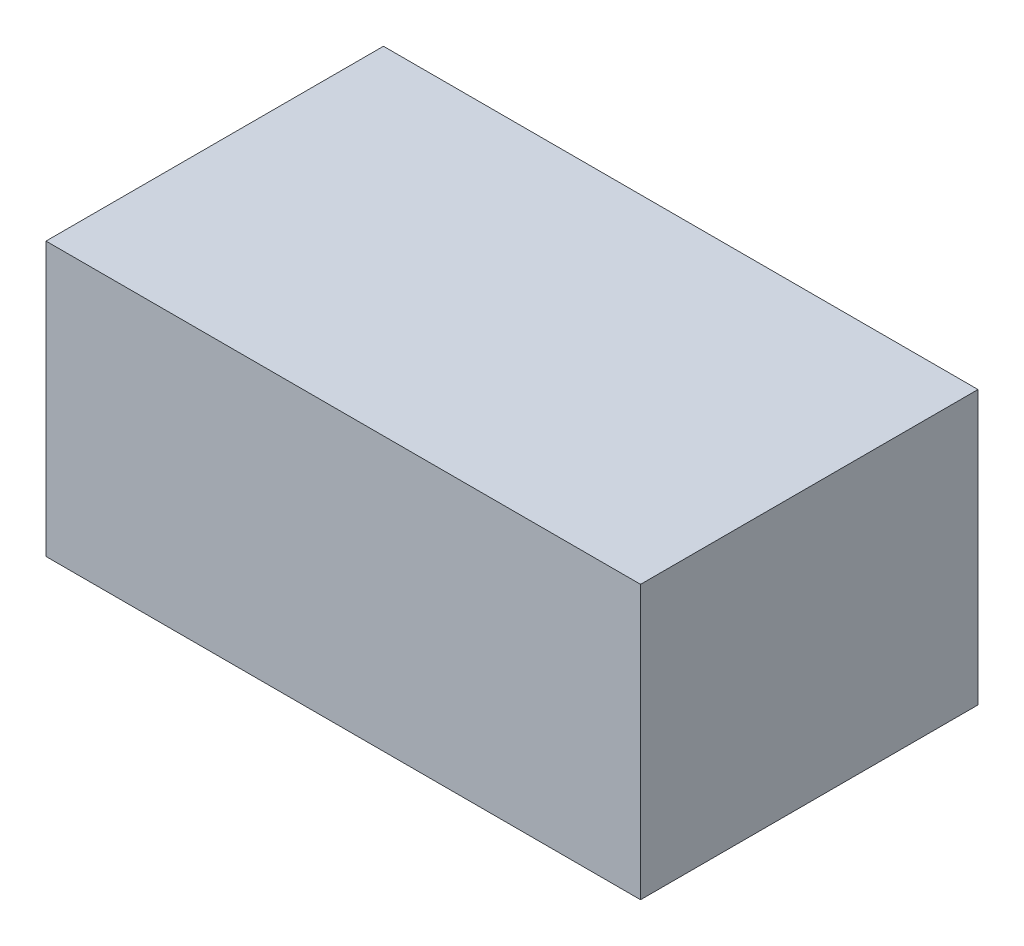
ISO-10303-21;
HEADER;
FILE_DESCRIPTION(('STEP AP214'),'2;1');
FILE_NAME('part.step','',(''),(''),'','','');
FILE_SCHEMA(('AUTOMOTIVE_DESIGN { 1 0 10303 214 1 1 1 1 }'));
ENDSEC;
DATA;
#1=APPLICATION_CONTEXT('core data for automotive mechanical design processes');
#2=APPLICATION_PROTOCOL_DEFINITION('international standard','automotive_design',2000,#1);
#3=PRODUCT_CONTEXT('',#1,'mechanical');
#4=PRODUCT('Part','Part','',(#3));
#5=PRODUCT_RELATED_PRODUCT_CATEGORY('part','',(#4));
#6=PRODUCT_DEFINITION_FORMATION('','',#4);
#7=PRODUCT_DEFINITION_CONTEXT('part definition',#1,'design');
#8=PRODUCT_DEFINITION('design','',#6,#7);
#9=PRODUCT_DEFINITION_SHAPE('','',#8);
#10=(LENGTH_UNIT() NAMED_UNIT(*) SI_UNIT(.MILLI.,.METRE.));
#11=(NAMED_UNIT(*) PLANE_ANGLE_UNIT() SI_UNIT($,.RADIAN.));
#12=(NAMED_UNIT(*) SI_UNIT($,.STERADIAN.) SOLID_ANGLE_UNIT());
#13=UNCERTAINTY_MEASURE_WITH_UNIT(LENGTH_MEASURE(1.E-05),#10,'distance_accuracy_value','');
#14=(GEOMETRIC_REPRESENTATION_CONTEXT(3) GLOBAL_UNCERTAINTY_ASSIGNED_CONTEXT((#13)) GLOBAL_UNIT_ASSIGNED_CONTEXT((#10,
#11,#12)) REPRESENTATION_CONTEXT('',''));
#15=CARTESIAN_POINT('',(0.,0.,0.));
#16=DIRECTION('',(0.,0.,1.));
#17=DIRECTION('',(1.,0.,0.));
#18=AXIS2_PLACEMENT_3D('',#15,#16,#17);
#19=CARTESIAN_POINT('',(-23.8225806451621,17.,42.2258064516134));
#20=DIRECTION('',(1.,0.,0.));
#21=DIRECTION('',(0.,0.,-1.));
#22=AXIS2_PLACEMENT_3D('',#19,#20,#21);
#23=PLANE('',#22);
#24=DIRECTION('',(0.,0.,1.));
#25=VECTOR('',#24,1.);
#26=CARTESIAN_POINT('',(-23.8225806451621,0.,42.2258064516134));
#27=LINE('',#26,#25);
#28=CARTESIAN_POINT('',(-23.8225806451621,0.,21.2258064516134));
#29=VERTEX_POINT('',#28);
#30=CARTESIAN_POINT('',(-23.8225806451621,0.,42.2258064516134));
#31=VERTEX_POINT('',#30);
#32=EDGE_CURVE('E140',#29,#31,#27,.T.);
#33=ORIENTED_EDGE('',*,*,#32,.T.);
#34=DIRECTION('',(0.,-1.,0.));
#35=VECTOR('',#34,1.);
#36=CARTESIAN_POINT('',(-23.8225806451621,17.,42.2258064516134));
#37=LINE('',#36,#35);
#38=CARTESIAN_POINT('',(-23.8225806451621,17.,42.2258064516134));
#39=VERTEX_POINT('',#38);
#40=EDGE_CURVE('E11',#39,#31,#37,.T.);
#41=ORIENTED_EDGE('',*,*,#40,.F.);
#42=DIRECTION('',(0.,0.,1.));
#43=VECTOR('',#42,1.);
#44=CARTESIAN_POINT('',(-23.8225806451621,17.,42.2258064516134));
#45=LINE('',#44,#43);
#46=CARTESIAN_POINT('',(-23.8225806451621,17.,21.2258064516134));
#47=VERTEX_POINT('',#46);
#48=EDGE_CURVE('E144',#47,#39,#45,.T.);
#49=ORIENTED_EDGE('',*,*,#48,.F.);
#50=DIRECTION('',(0.,-1.,0.));
#51=VECTOR('',#50,1.);
#52=CARTESIAN_POINT('',(-23.8225806451621,17.,21.2258064516134));
#53=LINE('',#52,#51);
#54=EDGE_CURVE('E150',#47,#29,#53,.T.);
#55=ORIENTED_EDGE('',*,*,#54,.T.);
#56=EDGE_LOOP('',(#33,#41,#49,#55));
#57=FACE_BOUND('',#56,.T.);
#58=ADVANCED_FACE('F33',(#57),#23,.F.);
#59=CARTESIAN_POINT('',(-23.8225806451621,17.,42.2258064516134));
#60=DIRECTION('',(0.,0.,-1.));
#61=DIRECTION('',(-1.,0.,0.));
#62=AXIS2_PLACEMENT_3D('',#59,#60,#61);
#63=PLANE('',#62);
#64=DIRECTION('',(1.,0.,0.));
#65=VECTOR('',#64,1.);
#66=CARTESIAN_POINT('',(-23.8225806451621,0.,42.2258064516134));
#67=LINE('',#66,#65);
#68=CARTESIAN_POINT('',(13.1774193548379,0.,42.2258064516134));
#69=VERTEX_POINT('',#68);
#70=EDGE_CURVE('E153',#31,#69,#67,.T.);
#71=ORIENTED_EDGE('',*,*,#70,.T.);
#72=DIRECTION('',(0.,-1.,0.));
#73=VECTOR('',#72,1.);
#74=CARTESIAN_POINT('',(13.1774193548379,17.,42.2258064516134));
#75=LINE('',#74,#73);
#76=CARTESIAN_POINT('',(13.1774193548379,17.,42.2258064516134));
#77=VERTEX_POINT('',#76);
#78=EDGE_CURVE('E40',#77,#69,#75,.T.);
#79=ORIENTED_EDGE('',*,*,#78,.F.);
#80=DIRECTION('',(1.,0.,0.));
#81=VECTOR('',#80,1.);
#82=CARTESIAN_POINT('',(-23.8225806451621,17.,42.2258064516134));
#83=LINE('',#82,#81);
#84=EDGE_CURVE('E84',#39,#77,#83,.T.);
#85=ORIENTED_EDGE('',*,*,#84,.F.);
#86=ORIENTED_EDGE('',*,*,#40,.T.);
#87=EDGE_LOOP('',(#71,#79,#85,#86));
#88=FACE_BOUND('',#87,.T.);
#89=ADVANCED_FACE('F182',(#88),#63,.F.);
#90=CARTESIAN_POINT('',(13.1774193548379,17.,42.2258064516134));
#91=DIRECTION('',(-1.,0.,0.));
#92=DIRECTION('',(0.,0.,1.));
#93=AXIS2_PLACEMENT_3D('',#90,#91,#92);
#94=PLANE('',#93);
#95=DIRECTION('',(0.,0.,-1.));
#96=VECTOR('',#95,1.);
#97=CARTESIAN_POINT('',(13.1774193548379,0.,42.2258064516134));
#98=LINE('',#97,#96);
#99=CARTESIAN_POINT('',(13.1774193548379,0.,21.2258064516134));
#100=VERTEX_POINT('',#99);
#101=EDGE_CURVE('E155',#69,#100,#98,.T.);
#102=ORIENTED_EDGE('',*,*,#101,.T.);
#103=DIRECTION('',(0.,-1.,0.));
#104=VECTOR('',#103,1.);
#105=CARTESIAN_POINT('',(13.1774193548379,17.,21.2258064516134));
#106=LINE('',#105,#104);
#107=CARTESIAN_POINT('',(13.1774193548379,17.,21.2258064516134));
#108=VERTEX_POINT('',#107);
#109=EDGE_CURVE('E159',#108,#100,#106,.T.);
#110=ORIENTED_EDGE('',*,*,#109,.F.);
#111=DIRECTION('',(0.,0.,-1.));
#112=VECTOR('',#111,1.);
#113=CARTESIAN_POINT('',(13.1774193548379,17.,42.2258064516134));
#114=LINE('',#113,#112);
#115=EDGE_CURVE('E147',#77,#108,#114,.T.);
#116=ORIENTED_EDGE('',*,*,#115,.F.);
#117=ORIENTED_EDGE('',*,*,#78,.T.);
#118=EDGE_LOOP('',(#102,#110,#116,#117));
#119=FACE_BOUND('',#118,.T.);
#120=ADVANCED_FACE('F164',(#119),#94,.F.);
#121=CARTESIAN_POINT('',(-23.8225806451621,17.,21.2258064516134));
#122=DIRECTION('',(0.,0.,1.));
#123=DIRECTION('',(1.,0.,0.));
#124=AXIS2_PLACEMENT_3D('',#121,#122,#123);
#125=PLANE('',#124);
#126=DIRECTION('',(-1.,0.,0.));
#127=VECTOR('',#126,1.);
#128=CARTESIAN_POINT('',(11.3024193548379,2.,21.2258064516134));
#129=LINE('',#128,#127);
#130=CARTESIAN_POINT('',(11.3024193548379,2.,21.2258064516134));
#131=VERTEX_POINT('',#130);
#132=CARTESIAN_POINT('',(-21.9475806451621,2.,21.2258064516134));
#133=VERTEX_POINT('',#132);
#134=EDGE_CURVE('E134',#131,#133,#129,.T.);
#135=ORIENTED_EDGE('',*,*,#134,.F.);
#136=DIRECTION('',(0.,-1.,0.));
#137=VECTOR('',#136,1.);
#138=CARTESIAN_POINT('',(11.3024193548379,15.,21.2258064516134));
#139=LINE('',#138,#137);
#140=CARTESIAN_POINT('',(11.3024193548379,15.,21.2258064516134));
#141=VERTEX_POINT('',#140);
#142=EDGE_CURVE('E47',#141,#131,#139,.T.);
#143=ORIENTED_EDGE('',*,*,#142,.F.);
#144=DIRECTION('',(-1.,0.,0.));
#145=VECTOR('',#144,1.);
#146=CARTESIAN_POINT('',(11.3024193548379,15.,21.2258064516134));
#147=LINE('',#146,#145);
#148=CARTESIAN_POINT('',(-21.9475806451621,15.,21.2258064516134));
#149=VERTEX_POINT('',#148);
#150=EDGE_CURVE('E125',#141,#149,#147,.T.);
#151=ORIENTED_EDGE('',*,*,#150,.T.);
#152=DIRECTION('',(0.,-1.,0.));
#153=VECTOR('',#152,1.);
#154=CARTESIAN_POINT('',(-21.9475806451621,15.,21.2258064516134));
#155=LINE('',#154,#153);
#156=EDGE_CURVE('E128',#149,#133,#155,.T.);
#157=ORIENTED_EDGE('',*,*,#156,.T.);
#158=EDGE_LOOP('',(#135,#143,#151,#157));
#159=FACE_BOUND('',#158,.T.);
#160=DIRECTION('',(-1.,0.,0.));
#161=VECTOR('',#160,1.);
#162=CARTESIAN_POINT('',(-23.8225806451621,0.,21.2258064516134));
#163=LINE('',#162,#161);
#164=EDGE_CURVE('E77',#100,#29,#163,.T.);
#165=ORIENTED_EDGE('',*,*,#164,.T.);
#166=ORIENTED_EDGE('',*,*,#54,.F.);
#167=DIRECTION('',(-1.,0.,0.));
#168=VECTOR('',#167,1.);
#169=CARTESIAN_POINT('',(-23.8225806451621,17.,21.2258064516134));
#170=LINE('',#169,#168);
#171=EDGE_CURVE('E56',#108,#47,#170,.T.);
#172=ORIENTED_EDGE('',*,*,#171,.F.);
#173=ORIENTED_EDGE('',*,*,#109,.T.);
#174=EDGE_LOOP('',(#165,#166,#172,#173));
#175=FACE_BOUND('',#174,.T.);
#176=ADVANCED_FACE('F172',(#159,#175),#125,.F.);
#177=CARTESIAN_POINT('',(0.,17.,0.));
#178=DIRECTION('',(0.,-1.,0.));
#179=DIRECTION('',(0.,0.,-1.));
#180=AXIS2_PLACEMENT_3D('',#177,#178,#179);
#181=PLANE('',#180);
#182=ORIENTED_EDGE('',*,*,#48,.T.);
#183=ORIENTED_EDGE('',*,*,#84,.T.);
#184=ORIENTED_EDGE('',*,*,#115,.T.);
#185=ORIENTED_EDGE('',*,*,#171,.T.);
#186=EDGE_LOOP('',(#182,#183,#184,#185));
#187=FACE_BOUND('',#186,.T.);
#188=ADVANCED_FACE('F174',(#187),#181,.F.);
#189=CARTESIAN_POINT('',(0.,0.,0.));
#190=DIRECTION('',(0.,-1.,0.));
#191=DIRECTION('',(0.,0.,-1.));
#192=AXIS2_PLACEMENT_3D('',#189,#190,#191);
#193=PLANE('',#192);
#194=ORIENTED_EDGE('',*,*,#32,.F.);
#195=ORIENTED_EDGE('',*,*,#164,.F.);
#196=ORIENTED_EDGE('',*,*,#101,.F.);
#197=ORIENTED_EDGE('',*,*,#70,.F.);
#198=EDGE_LOOP('',(#194,#195,#196,#197));
#199=FACE_BOUND('',#198,.T.);
#200=ADVANCED_FACE('F168',(#199),#193,.T.);
#201=CARTESIAN_POINT('',(11.3024193548379,15.,40.2258064516134));
#202=DIRECTION('',(1.,0.,0.));
#203=DIRECTION('',(0.,0.,-1.));
#204=AXIS2_PLACEMENT_3D('',#201,#202,#203);
#205=PLANE('',#204);
#206=ORIENTED_EDGE('',*,*,#142,.T.);
#207=DIRECTION('',(0.,0.,-1.));
#208=VECTOR('',#207,1.);
#209=CARTESIAN_POINT('',(11.3024193548379,2.,40.2258064516134));
#210=LINE('',#209,#208);
#211=CARTESIAN_POINT('',(11.3024193548379,2.,40.2258064516134));
#212=VERTEX_POINT('',#211);
#213=EDGE_CURVE('E104',#212,#131,#210,.T.);
#214=ORIENTED_EDGE('',*,*,#213,.F.);
#215=DIRECTION('',(0.,-1.,0.));
#216=VECTOR('',#215,1.);
#217=CARTESIAN_POINT('',(11.3024193548379,15.,40.2258064516134));
#218=LINE('',#217,#216);
#219=CARTESIAN_POINT('',(11.3024193548379,15.,40.2258064516134));
#220=VERTEX_POINT('',#219);
#221=EDGE_CURVE('E108',#220,#212,#218,.T.);
#222=ORIENTED_EDGE('',*,*,#221,.F.);
#223=DIRECTION('',(0.,0.,-1.));
#224=VECTOR('',#223,1.);
#225=CARTESIAN_POINT('',(11.3024193548379,15.,40.2258064516134));
#226=LINE('',#225,#224);
#227=EDGE_CURVE('E138',#220,#141,#226,.T.);
#228=ORIENTED_EDGE('',*,*,#227,.T.);
#229=EDGE_LOOP('',(#206,#214,#222,#228));
#230=FACE_BOUND('',#229,.T.);
#231=ADVANCED_FACE('F106',(#230),#205,.F.);
#232=CARTESIAN_POINT('',(11.3024193548379,15.,40.2258064516134));
#233=DIRECTION('',(0.,-1.,0.));
#234=DIRECTION('',(0.,0.,-1.));
#235=AXIS2_PLACEMENT_3D('',#232,#233,#234);
#236=PLANE('',#235);
#237=ORIENTED_EDGE('',*,*,#150,.F.);
#238=ORIENTED_EDGE('',*,*,#227,.F.);
#239=DIRECTION('',(-1.,0.,0.));
#240=VECTOR('',#239,1.);
#241=CARTESIAN_POINT('',(11.3024193548379,15.,40.2258064516134));
#242=LINE('',#241,#240);
#243=CARTESIAN_POINT('',(-21.9475806451621,15.,40.2258064516134));
#244=VERTEX_POINT('',#243);
#245=EDGE_CURVE('E113',#220,#244,#242,.T.);
#246=ORIENTED_EDGE('',*,*,#245,.T.);
#247=DIRECTION('',(0.,0.,-1.));
#248=VECTOR('',#247,1.);
#249=CARTESIAN_POINT('',(-21.9475806451621,15.,40.2258064516134));
#250=LINE('',#249,#248);
#251=EDGE_CURVE('E141',#244,#149,#250,.T.);
#252=ORIENTED_EDGE('',*,*,#251,.T.);
#253=EDGE_LOOP('',(#237,#238,#246,#252));
#254=FACE_BOUND('',#253,.T.);
#255=ADVANCED_FACE('F221',(#254),#236,.T.);
#256=CARTESIAN_POINT('',(-21.9475806451621,15.,40.2258064516134));
#257=DIRECTION('',(1.,0.,0.));
#258=DIRECTION('',(0.,1.,0.));
#259=AXIS2_PLACEMENT_3D('',#256,#257,#258);
#260=PLANE('',#259);
#261=ORIENTED_EDGE('',*,*,#156,.F.);
#262=ORIENTED_EDGE('',*,*,#251,.F.);
#263=DIRECTION('',(0.,-1.,0.));
#264=VECTOR('',#263,1.);
#265=CARTESIAN_POINT('',(-21.9475806451621,15.,40.2258064516134));
#266=LINE('',#265,#264);
#267=CARTESIAN_POINT('',(-21.9475806451621,2.,40.2258064516134));
#268=VERTEX_POINT('',#267);
#269=EDGE_CURVE('E121',#244,#268,#266,.T.);
#270=ORIENTED_EDGE('',*,*,#269,.T.);
#271=DIRECTION('',(0.,0.,-1.));
#272=VECTOR('',#271,1.);
#273=CARTESIAN_POINT('',(-21.9475806451621,2.,40.2258064516134));
#274=LINE('',#273,#272);
#275=EDGE_CURVE('E112',#268,#133,#274,.T.);
#276=ORIENTED_EDGE('',*,*,#275,.T.);
#277=EDGE_LOOP('',(#261,#262,#270,#276));
#278=FACE_BOUND('',#277,.T.);
#279=ADVANCED_FACE('F230',(#278),#260,.T.);
#280=CARTESIAN_POINT('',(11.3024193548379,2.,40.2258064516134));
#281=DIRECTION('',(0.,-1.,0.));
#282=DIRECTION('',(0.,0.,-1.));
#283=AXIS2_PLACEMENT_3D('',#280,#281,#282);
#284=PLANE('',#283);
#285=ORIENTED_EDGE('',*,*,#134,.T.);
#286=ORIENTED_EDGE('',*,*,#275,.F.);
#287=DIRECTION('',(-1.,0.,0.));
#288=VECTOR('',#287,1.);
#289=CARTESIAN_POINT('',(11.3024193548379,2.,40.2258064516134));
#290=LINE('',#289,#288);
#291=EDGE_CURVE('E117',#212,#268,#290,.T.);
#292=ORIENTED_EDGE('',*,*,#291,.F.);
#293=ORIENTED_EDGE('',*,*,#213,.T.);
#294=EDGE_LOOP('',(#285,#286,#292,#293));
#295=FACE_BOUND('',#294,.T.);
#296=ADVANCED_FACE('F118',(#295),#284,.F.);
#297=CARTESIAN_POINT('',(0.,0.,40.2258064516134));
#298=DIRECTION('',(0.,0.,-1.));
#299=DIRECTION('',(-1.,0.,0.));
#300=AXIS2_PLACEMENT_3D('',#297,#298,#299);
#301=PLANE('',#300);
#302=ORIENTED_EDGE('',*,*,#221,.T.);
#303=ORIENTED_EDGE('',*,*,#291,.T.);
#304=ORIENTED_EDGE('',*,*,#269,.F.);
#305=ORIENTED_EDGE('',*,*,#245,.F.);
#306=EDGE_LOOP('',(#302,#303,#304,#305));
#307=FACE_BOUND('',#306,.T.);
#308=ADVANCED_FACE('F124',(#307),#301,.T.);
#309=CLOSED_SHELL('',(#58,#89,#120,#176,#188,#200,#231,#255,#279,#296,#308));
#310=MANIFOLD_SOLID_BREP('B2',#309);
#311=ADVANCED_BREP_SHAPE_REPRESENTATION('',(#18,#310),#14);
#312=SHAPE_DEFINITION_REPRESENTATION(#9,#311);
ENDSEC;
END-ISO-10303-21;
